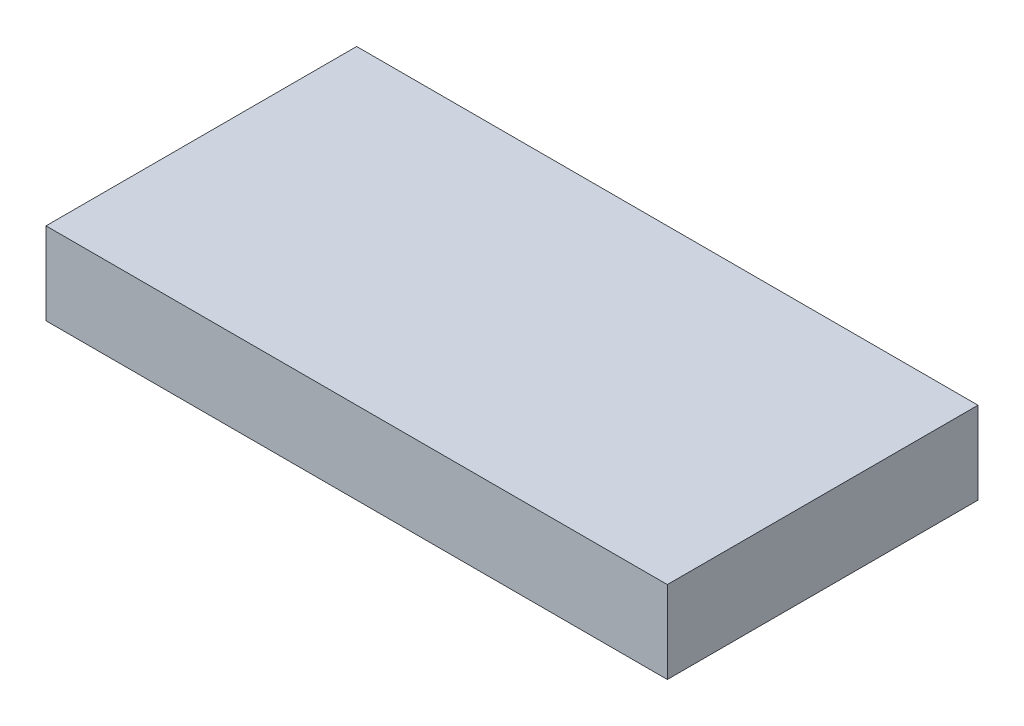
ISO-10303-21;
HEADER;
FILE_DESCRIPTION(('STEP AP214'),'2;1');
FILE_NAME('part.step','',(''),(''),'','','');
FILE_SCHEMA(('AUTOMOTIVE_DESIGN { 1 0 10303 214 1 1 1 1 }'));
ENDSEC;
DATA;
#1=APPLICATION_CONTEXT('core data for automotive mechanical design processes');
#2=APPLICATION_PROTOCOL_DEFINITION('international standard','automotive_design',2000,#1);
#3=PRODUCT_CONTEXT('',#1,'mechanical');
#4=PRODUCT('Part','Part','',(#3));
#5=PRODUCT_RELATED_PRODUCT_CATEGORY('part','',(#4));
#6=PRODUCT_DEFINITION_FORMATION('','',#4);
#7=PRODUCT_DEFINITION_CONTEXT('part definition',#1,'design');
#8=PRODUCT_DEFINITION('design','',#6,#7);
#9=PRODUCT_DEFINITION_SHAPE('','',#8);
#10=(LENGTH_UNIT() NAMED_UNIT(*) SI_UNIT(.MILLI.,.METRE.));
#11=(NAMED_UNIT(*) PLANE_ANGLE_UNIT() SI_UNIT($,.RADIAN.));
#12=(NAMED_UNIT(*) SI_UNIT($,.STERADIAN.) SOLID_ANGLE_UNIT());
#13=UNCERTAINTY_MEASURE_WITH_UNIT(LENGTH_MEASURE(1.E-05),#10,'distance_accuracy_value','');
#14=(GEOMETRIC_REPRESENTATION_CONTEXT(3) GLOBAL_UNCERTAINTY_ASSIGNED_CONTEXT((#13)) GLOBAL_UNIT_ASSIGNED_CONTEXT((#10,
#11,#12)) REPRESENTATION_CONTEXT('',''));
#15=CARTESIAN_POINT('',(0.,0.,0.));
#16=DIRECTION('',(0.,0.,1.));
#17=DIRECTION('',(1.,0.,0.));
#18=AXIS2_PLACEMENT_3D('',#15,#16,#17);
#19=CARTESIAN_POINT('',(0.,0.,0.));
#20=DIRECTION('',(0.,-1.,0.));
#21=DIRECTION('',(0.,0.,-1.));
#22=AXIS2_PLACEMENT_3D('',#19,#20,#21);
#23=PLANE('',#22);
#24=CARTESIAN_POINT('',(177.8,0.,-69.85));
#25=DIRECTION('',(0.,-1.,0.));
#26=DIRECTION('',(0.,0.,-1.));
#27=AXIS2_PLACEMENT_3D('',#24,#25,#26);
#28=CIRCLE('',#27,25.4);
#29=CARTESIAN_POINT('',(177.8,0.,-95.25));
#30=VERTEX_POINT('',#29);
#31=EDGE_CURVE('E125',#30,#30,#28,.T.);
#32=ORIENTED_EDGE('',*,*,#31,.F.);
#33=EDGE_LOOP('',(#32));
#34=FACE_BOUND('',#33,.T.);
#35=CARTESIAN_POINT('',(-177.8,0.,69.85));
#36=DIRECTION('',(0.,-1.,0.));
#37=DIRECTION('',(0.,0.,-1.));
#38=AXIS2_PLACEMENT_3D('',#35,#36,#37);
#39=CIRCLE('',#38,25.4);
#40=CARTESIAN_POINT('',(-177.8,0.,44.45));
#41=VERTEX_POINT('',#40);
#42=EDGE_CURVE('E113',#41,#41,#39,.T.);
#43=ORIENTED_EDGE('',*,*,#42,.F.);
#44=EDGE_LOOP('',(#43));
#45=FACE_BOUND('',#44,.T.);
#46=DIRECTION('',(0.,0.,-1.));
#47=VECTOR('',#46,1.);
#48=CARTESIAN_POINT('',(215.9,0.,107.95));
#49=LINE('',#48,#47);
#50=CARTESIAN_POINT('',(215.9,0.,107.95));
#51=VERTEX_POINT('',#50);
#52=CARTESIAN_POINT('',(215.9,0.,-107.95));
#53=VERTEX_POINT('',#52);
#54=EDGE_CURVE('E99',#51,#53,#49,.T.);
#55=ORIENTED_EDGE('',*,*,#54,.F.);
#56=DIRECTION('',(1.,0.,0.));
#57=VECTOR('',#56,1.);
#58=CARTESIAN_POINT('',(-215.9,0.,107.95));
#59=LINE('',#58,#57);
#60=CARTESIAN_POINT('',(-215.9,0.,107.95));
#61=VERTEX_POINT('',#60);
#62=EDGE_CURVE('E75',#61,#51,#59,.T.);
#63=ORIENTED_EDGE('',*,*,#62,.F.);
#64=DIRECTION('',(0.,0.,1.));
#65=VECTOR('',#64,1.);
#66=CARTESIAN_POINT('',(-215.9,0.,107.95));
#67=LINE('',#66,#65);
#68=CARTESIAN_POINT('',(-215.9,0.,-107.95));
#69=VERTEX_POINT('',#68);
#70=EDGE_CURVE('E69',#69,#61,#67,.T.);
#71=ORIENTED_EDGE('',*,*,#70,.F.);
#72=DIRECTION('',(-1.,0.,0.));
#73=VECTOR('',#72,1.);
#74=CARTESIAN_POINT('',(-215.9,0.,-107.95));
#75=LINE('',#74,#73);
#76=EDGE_CURVE('E91',#53,#69,#75,.T.);
#77=ORIENTED_EDGE('',*,*,#76,.F.);
#78=EDGE_LOOP('',(#55,#63,#71,#77));
#79=FACE_BOUND('',#78,.T.);
#80=CARTESIAN_POINT('',(-177.8,0.,-69.85));
#81=DIRECTION('',(0.,-1.,0.));
#82=DIRECTION('',(0.,0.,-1.));
#83=AXIS2_PLACEMENT_3D('',#80,#81,#82);
#84=CIRCLE('',#83,25.4);
#85=CARTESIAN_POINT('',(-177.8,0.,-95.25));
#86=VERTEX_POINT('',#85);
#87=EDGE_CURVE('E119',#86,#86,#84,.T.);
#88=ORIENTED_EDGE('',*,*,#87,.F.);
#89=EDGE_LOOP('',(#88));
#90=FACE_BOUND('',#89,.T.);
#91=CARTESIAN_POINT('',(177.8,0.,69.85));
#92=DIRECTION('',(0.,-1.,0.));
#93=DIRECTION('',(0.,0.,-1.));
#94=AXIS2_PLACEMENT_3D('',#91,#92,#93);
#95=CIRCLE('',#94,25.4);
#96=CARTESIAN_POINT('',(177.8,0.,44.45));
#97=VERTEX_POINT('',#96);
#98=EDGE_CURVE('E131',#97,#97,#95,.T.);
#99=ORIENTED_EDGE('',*,*,#98,.F.);
#100=EDGE_LOOP('',(#99));
#101=FACE_BOUND('',#100,.T.);
#102=ADVANCED_FACE('F35',(#34,#45,#79,#90,#101),#23,.T.);
#103=CARTESIAN_POINT('',(215.9,57.15,107.95));
#104=DIRECTION('',(-1.,0.,0.));
#105=DIRECTION('',(0.,0.,1.));
#106=AXIS2_PLACEMENT_3D('',#103,#104,#105);
#107=PLANE('',#106);
#108=ORIENTED_EDGE('',*,*,#54,.T.);
#109=DIRECTION('',(0.,-1.,0.));
#110=VECTOR('',#109,1.);
#111=CARTESIAN_POINT('',(215.9,57.15,-107.95));
#112=LINE('',#111,#110);
#113=CARTESIAN_POINT('',(215.9,57.15,-107.95));
#114=VERTEX_POINT('',#113);
#115=EDGE_CURVE('E11',#114,#53,#112,.T.);
#116=ORIENTED_EDGE('',*,*,#115,.F.);
#117=DIRECTION('',(0.,0.,-1.));
#118=VECTOR('',#117,1.);
#119=CARTESIAN_POINT('',(215.9,57.15,107.95));
#120=LINE('',#119,#118);
#121=CARTESIAN_POINT('',(215.9,57.15,107.95));
#122=VERTEX_POINT('',#121);
#123=EDGE_CURVE('E87',#122,#114,#120,.T.);
#124=ORIENTED_EDGE('',*,*,#123,.F.);
#125=DIRECTION('',(0.,-1.,0.));
#126=VECTOR('',#125,1.);
#127=CARTESIAN_POINT('',(215.9,57.15,107.95));
#128=LINE('',#127,#126);
#129=EDGE_CURVE('E95',#122,#51,#128,.T.);
#130=ORIENTED_EDGE('',*,*,#129,.T.);
#131=EDGE_LOOP('',(#108,#116,#124,#130));
#132=FACE_BOUND('',#131,.T.);
#133=ADVANCED_FACE('F37',(#132),#107,.F.);
#134=CARTESIAN_POINT('',(-215.9,57.15,-107.95));
#135=DIRECTION('',(0.,0.,1.));
#136=DIRECTION('',(1.,0.,0.));
#137=AXIS2_PLACEMENT_3D('',#134,#135,#136);
#138=PLANE('',#137);
#139=ORIENTED_EDGE('',*,*,#76,.T.);
#140=DIRECTION('',(0.,-1.,0.));
#141=VECTOR('',#140,1.);
#142=CARTESIAN_POINT('',(-215.9,57.15,-107.95));
#143=LINE('',#142,#141);
#144=CARTESIAN_POINT('',(-215.9,57.15,-107.95));
#145=VERTEX_POINT('',#144);
#146=EDGE_CURVE('E44',#145,#69,#143,.T.);
#147=ORIENTED_EDGE('',*,*,#146,.F.);
#148=DIRECTION('',(-1.,0.,0.));
#149=VECTOR('',#148,1.);
#150=CARTESIAN_POINT('',(-215.9,57.15,-107.95));
#151=LINE('',#150,#149);
#152=EDGE_CURVE('E82',#114,#145,#151,.T.);
#153=ORIENTED_EDGE('',*,*,#152,.F.);
#154=ORIENTED_EDGE('',*,*,#115,.T.);
#155=EDGE_LOOP('',(#139,#147,#153,#154));
#156=FACE_BOUND('',#155,.T.);
#157=ADVANCED_FACE('F90',(#156),#138,.F.);
#158=CARTESIAN_POINT('',(-215.9,57.15,107.95));
#159=DIRECTION('',(1.,0.,0.));
#160=DIRECTION('',(0.,0.,-1.));
#161=AXIS2_PLACEMENT_3D('',#158,#159,#160);
#162=PLANE('',#161);
#163=ORIENTED_EDGE('',*,*,#70,.T.);
#164=DIRECTION('',(0.,-1.,0.));
#165=VECTOR('',#164,1.);
#166=CARTESIAN_POINT('',(-215.9,57.15,107.95));
#167=LINE('',#166,#165);
#168=CARTESIAN_POINT('',(-215.9,57.15,107.95));
#169=VERTEX_POINT('',#168);
#170=EDGE_CURVE('E92',#169,#61,#167,.T.);
#171=ORIENTED_EDGE('',*,*,#170,.F.);
#172=DIRECTION('',(0.,0.,1.));
#173=VECTOR('',#172,1.);
#174=CARTESIAN_POINT('',(-215.9,57.15,107.95));
#175=LINE('',#174,#173);
#176=EDGE_CURVE('E85',#145,#169,#175,.T.);
#177=ORIENTED_EDGE('',*,*,#176,.F.);
#178=ORIENTED_EDGE('',*,*,#146,.T.);
#179=EDGE_LOOP('',(#163,#171,#177,#178));
#180=FACE_BOUND('',#179,.T.);
#181=ADVANCED_FACE('F93',(#180),#162,.F.);
#182=CARTESIAN_POINT('',(-215.9,57.15,107.95));
#183=DIRECTION('',(0.,0.,-1.));
#184=DIRECTION('',(-1.,0.,0.));
#185=AXIS2_PLACEMENT_3D('',#182,#183,#184);
#186=PLANE('',#185);
#187=ORIENTED_EDGE('',*,*,#62,.T.);
#188=ORIENTED_EDGE('',*,*,#129,.F.);
#189=DIRECTION('',(1.,0.,0.));
#190=VECTOR('',#189,1.);
#191=CARTESIAN_POINT('',(-215.9,57.15,107.95));
#192=LINE('',#191,#190);
#193=EDGE_CURVE('E52',#169,#122,#192,.T.);
#194=ORIENTED_EDGE('',*,*,#193,.F.);
#195=ORIENTED_EDGE('',*,*,#170,.T.);
#196=EDGE_LOOP('',(#187,#188,#194,#195));
#197=FACE_BOUND('',#196,.T.);
#198=ADVANCED_FACE('F107',(#197),#186,.F.);
#199=CARTESIAN_POINT('',(0.,57.15,0.));
#200=DIRECTION('',(0.,-1.,0.));
#201=DIRECTION('',(0.,0.,-1.));
#202=AXIS2_PLACEMENT_3D('',#199,#200,#201);
#203=PLANE('',#202);
#204=ORIENTED_EDGE('',*,*,#123,.T.);
#205=ORIENTED_EDGE('',*,*,#152,.T.);
#206=ORIENTED_EDGE('',*,*,#176,.T.);
#207=ORIENTED_EDGE('',*,*,#193,.T.);
#208=EDGE_LOOP('',(#204,#205,#206,#207));
#209=FACE_BOUND('',#208,.T.);
#210=ADVANCED_FACE('F83',(#209),#203,.F.);
#211=CARTESIAN_POINT('',(-177.8,-3.175,69.85));
#212=DIRECTION('',(0.,1.,0.));
#213=DIRECTION('',(0.,0.,1.));
#214=AXIS2_PLACEMENT_3D('',#211,#212,#213);
#215=CYLINDRICAL_SURFACE('',#214,25.4);
#216=CARTESIAN_POINT('',(-177.8,-3.175,69.85));
#217=DIRECTION('',(0.,-1.,0.));
#218=DIRECTION('',(0.,0.,-1.));
#219=AXIS2_PLACEMENT_3D('',#216,#217,#218);
#220=CIRCLE('',#219,25.4);
#221=CARTESIAN_POINT('',(-177.8,-3.175,44.45));
#222=VERTEX_POINT('',#221);
#223=EDGE_CURVE('E102',#222,#222,#220,.T.);
#224=ORIENTED_EDGE('',*,*,#223,.F.);
#225=EDGE_LOOP('',(#224));
#226=FACE_BOUND('',#225,.T.);
#227=ORIENTED_EDGE('',*,*,#42,.T.);
#228=EDGE_LOOP('',(#227));
#229=FACE_BOUND('',#228,.T.);
#230=ADVANCED_FACE('F179',(#226,#229),#215,.T.);
#231=CARTESIAN_POINT('',(-177.8,-3.175,69.85));
#232=DIRECTION('',(0.,-1.,0.));
#233=DIRECTION('',(0.,0.,-1.));
#234=AXIS2_PLACEMENT_3D('',#231,#232,#233);
#235=PLANE('',#234);
#236=ORIENTED_EDGE('',*,*,#223,.T.);
#237=EDGE_LOOP('',(#236));
#238=FACE_BOUND('',#237,.T.);
#239=ADVANCED_FACE('F185',(#238),#235,.T.);
#240=CARTESIAN_POINT('',(-177.8,-3.175,-69.85));
#241=DIRECTION('',(0.,1.,0.));
#242=DIRECTION('',(0.,0.,1.));
#243=AXIS2_PLACEMENT_3D('',#240,#241,#242);
#244=CYLINDRICAL_SURFACE('',#243,25.4);
#245=CARTESIAN_POINT('',(-177.8,-3.175,-69.85));
#246=DIRECTION('',(0.,-1.,0.));
#247=DIRECTION('',(0.,0.,-1.));
#248=AXIS2_PLACEMENT_3D('',#245,#246,#247);
#249=CIRCLE('',#248,25.4);
#250=CARTESIAN_POINT('',(-177.8,-3.175,-95.25));
#251=VERTEX_POINT('',#250);
#252=EDGE_CURVE('E116',#251,#251,#249,.T.);
#253=ORIENTED_EDGE('',*,*,#252,.F.);
#254=EDGE_LOOP('',(#253));
#255=FACE_BOUND('',#254,.T.);
#256=ORIENTED_EDGE('',*,*,#87,.T.);
#257=EDGE_LOOP('',(#256));
#258=FACE_BOUND('',#257,.T.);
#259=ADVANCED_FACE('F192',(#255,#258),#244,.T.);
#260=CARTESIAN_POINT('',(-177.8,-3.175,-69.85));
#261=DIRECTION('',(0.,-1.,0.));
#262=DIRECTION('',(0.,0.,-1.));
#263=AXIS2_PLACEMENT_3D('',#260,#261,#262);
#264=PLANE('',#263);
#265=ORIENTED_EDGE('',*,*,#252,.T.);
#266=EDGE_LOOP('',(#265));
#267=FACE_BOUND('',#266,.T.);
#268=ADVANCED_FACE('F200',(#267),#264,.T.);
#269=CARTESIAN_POINT('',(177.8,-3.175,-69.85));
#270=DIRECTION('',(0.,1.,0.));
#271=DIRECTION('',(0.,0.,1.));
#272=AXIS2_PLACEMENT_3D('',#269,#270,#271);
#273=CYLINDRICAL_SURFACE('',#272,25.4);
#274=CARTESIAN_POINT('',(177.8,-3.175,-69.85));
#275=DIRECTION('',(0.,-1.,0.));
#276=DIRECTION('',(0.,0.,-1.));
#277=AXIS2_PLACEMENT_3D('',#274,#275,#276);
#278=CIRCLE('',#277,25.4);
#279=CARTESIAN_POINT('',(177.8,-3.175,-95.25));
#280=VERTEX_POINT('',#279);
#281=EDGE_CURVE('E122',#280,#280,#278,.T.);
#282=ORIENTED_EDGE('',*,*,#281,.F.);
#283=EDGE_LOOP('',(#282));
#284=FACE_BOUND('',#283,.T.);
#285=ORIENTED_EDGE('',*,*,#31,.T.);
#286=EDGE_LOOP('',(#285));
#287=FACE_BOUND('',#286,.T.);
#288=ADVANCED_FACE('F208',(#284,#287),#273,.T.);
#289=CARTESIAN_POINT('',(177.8,-3.175,-69.85));
#290=DIRECTION('',(0.,-1.,0.));
#291=DIRECTION('',(0.,0.,-1.));
#292=AXIS2_PLACEMENT_3D('',#289,#290,#291);
#293=PLANE('',#292);
#294=ORIENTED_EDGE('',*,*,#281,.T.);
#295=EDGE_LOOP('',(#294));
#296=FACE_BOUND('',#295,.T.);
#297=ADVANCED_FACE('F142',(#296),#293,.T.);
#298=CARTESIAN_POINT('',(177.8,-3.175,69.85));
#299=DIRECTION('',(0.,1.,0.));
#300=DIRECTION('',(0.,0.,1.));
#301=AXIS2_PLACEMENT_3D('',#298,#299,#300);
#302=CYLINDRICAL_SURFACE('',#301,25.4);
#303=CARTESIAN_POINT('',(177.8,-3.175,69.85));
#304=DIRECTION('',(0.,-1.,0.));
#305=DIRECTION('',(0.,0.,-1.));
#306=AXIS2_PLACEMENT_3D('',#303,#304,#305);
#307=CIRCLE('',#306,25.4);
#308=CARTESIAN_POINT('',(177.8,-3.175,44.45));
#309=VERTEX_POINT('',#308);
#310=EDGE_CURVE('E128',#309,#309,#307,.T.);
#311=ORIENTED_EDGE('',*,*,#310,.F.);
#312=EDGE_LOOP('',(#311));
#313=FACE_BOUND('',#312,.T.);
#314=ORIENTED_EDGE('',*,*,#98,.T.);
#315=EDGE_LOOP('',(#314));
#316=FACE_BOUND('',#315,.T.);
#317=ADVANCED_FACE('F139',(#313,#316),#302,.T.);
#318=CARTESIAN_POINT('',(177.8,-3.175,69.85));
#319=DIRECTION('',(0.,-1.,0.));
#320=DIRECTION('',(0.,0.,-1.));
#321=AXIS2_PLACEMENT_3D('',#318,#319,#320);
#322=PLANE('',#321);
#323=ORIENTED_EDGE('',*,*,#310,.T.);
#324=EDGE_LOOP('',(#323));
#325=FACE_BOUND('',#324,.T.);
#326=ADVANCED_FACE('F137',(#325),#322,.T.);
#327=CLOSED_SHELL('',(#102,#133,#157,#181,#198,#210,#230,#239,#259,#268,#288,#297,#317,#326));
#328=MANIFOLD_SOLID_BREP('B2',#327);
#329=ADVANCED_BREP_SHAPE_REPRESENTATION('',(#18,#328),#14);
#330=SHAPE_DEFINITION_REPRESENTATION(#9,#329);
ENDSEC;
END-ISO-10303-21;
